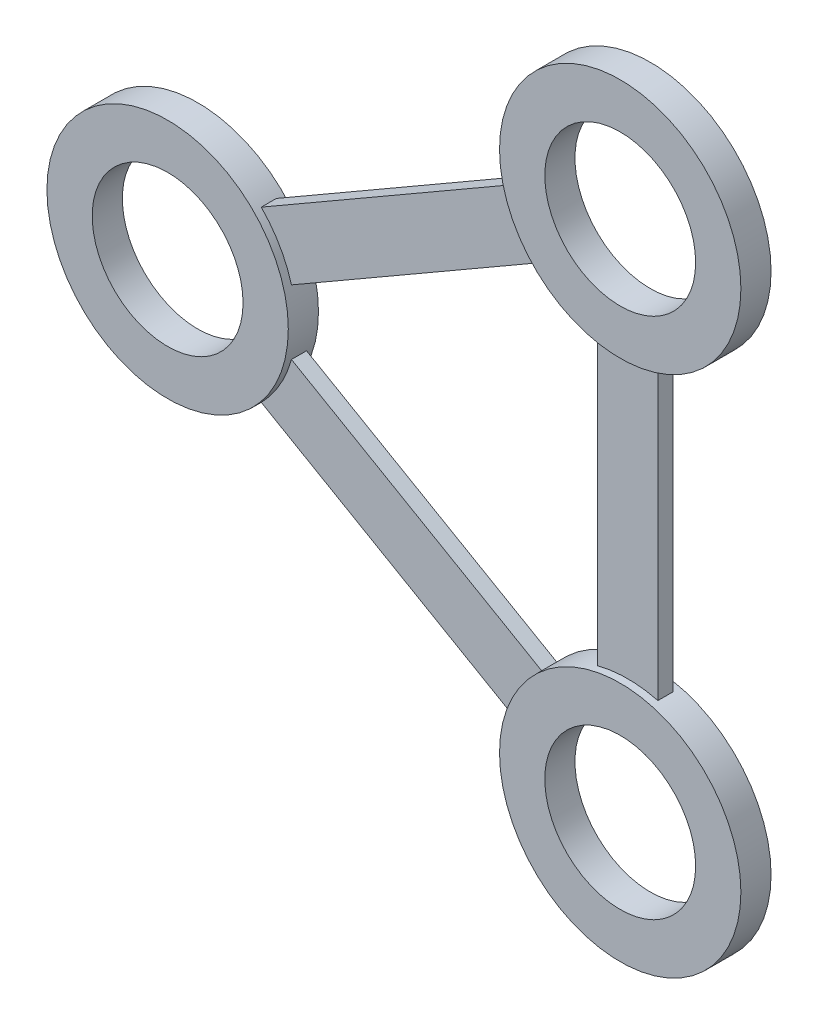
ISO-10303-21;
HEADER;
FILE_DESCRIPTION(('STEP AP214'),'2;1');
FILE_NAME('part.step','',(''),(''),'','','');
FILE_SCHEMA(('AUTOMOTIVE_DESIGN { 1 0 10303 214 1 1 1 1 }'));
ENDSEC;
DATA;
#1=APPLICATION_CONTEXT('core data for automotive mechanical design processes');
#2=APPLICATION_PROTOCOL_DEFINITION('international standard','automotive_design',2000,#1);
#3=PRODUCT_CONTEXT('',#1,'mechanical');
#4=PRODUCT('Part','Part','',(#3));
#5=PRODUCT_RELATED_PRODUCT_CATEGORY('part','',(#4));
#6=PRODUCT_DEFINITION_FORMATION('','',#4);
#7=PRODUCT_DEFINITION_CONTEXT('part definition',#1,'design');
#8=PRODUCT_DEFINITION('design','',#6,#7);
#9=PRODUCT_DEFINITION_SHAPE('','',#8);
#10=(LENGTH_UNIT() NAMED_UNIT(*) SI_UNIT(.MILLI.,.METRE.));
#11=(NAMED_UNIT(*) PLANE_ANGLE_UNIT() SI_UNIT($,.RADIAN.));
#12=(NAMED_UNIT(*) SI_UNIT($,.STERADIAN.) SOLID_ANGLE_UNIT());
#13=UNCERTAINTY_MEASURE_WITH_UNIT(LENGTH_MEASURE(1.E-05),#10,'distance_accuracy_value','');
#14=(GEOMETRIC_REPRESENTATION_CONTEXT(3) GLOBAL_UNCERTAINTY_ASSIGNED_CONTEXT((#13)) GLOBAL_UNIT_ASSIGNED_CONTEXT((#10,
#11,#12)) REPRESENTATION_CONTEXT('',''));
#15=CARTESIAN_POINT('',(0.,0.,0.));
#16=DIRECTION('',(0.,0.,1.));
#17=DIRECTION('',(1.,0.,0.));
#18=AXIS2_PLACEMENT_3D('',#15,#16,#17);
#19=CARTESIAN_POINT('',(-24.7835759049961,42.9264126606929,2.5));
#20=DIRECTION('',(-0.500000000000001,0.866025403784438,0.));
#21=DIRECTION('',(-0.866025403784438,-0.500000000000001,0.));
#22=AXIS2_PLACEMENT_3D('',#19,#20,#21);
#23=PLANE('',#22);
#24=DIRECTION('',(0.866025403784438,0.500000000000001,0.));
#25=VECTOR('',#24,1.);
#26=CARTESIAN_POINT('',(-24.7835759049961,42.9264126606929,-2.5));
#27=LINE('',#26,#25);
#28=CARTESIAN_POINT('',(-50.593283957487,28.0251707688815,-2.5));
#29=VERTEX_POINT('',#28);
#30=CARTESIAN_POINT('',(32.3246767175193,75.8978776852514,-2.5));
#31=VERTEX_POINT('',#30);
#32=EDGE_CURVE('E263',#29,#31,#27,.T.);
#33=ORIENTED_EDGE('',*,*,#32,.F.);
#34=DIRECTION('',(0.,0.,-1.));
#35=VECTOR('',#34,1.);
#36=CARTESIAN_POINT('',(-50.593283957487,28.0251707688815,2.5));
#37=LINE('',#36,#35);
#38=CARTESIAN_POINT('',(-50.593283957487,28.0251707688815,2.5));
#39=VERTEX_POINT('',#38);
#40=EDGE_CURVE('E47',#39,#29,#37,.T.);
#41=ORIENTED_EDGE('',*,*,#40,.F.);
#42=DIRECTION('',(0.866025403784438,0.500000000000001,0.));
#43=VECTOR('',#42,1.);
#44=CARTESIAN_POINT('',(-24.7835759049961,42.9264126606929,2.5));
#45=LINE('',#44,#43);
#46=CARTESIAN_POINT('',(32.3246767175193,75.8978776852514,2.5));
#47=VERTEX_POINT('',#46);
#48=EDGE_CURVE('E247',#39,#47,#45,.T.);
#49=ORIENTED_EDGE('',*,*,#48,.T.);
#50=DIRECTION('',(0.,0.,-1.));
#51=VECTOR('',#50,1.);
#52=CARTESIAN_POINT('',(32.3246767175194,75.8978776852514,2.5));
#53=LINE('',#52,#51);
#54=EDGE_CURVE('E11',#47,#31,#53,.T.);
#55=ORIENTED_EDGE('',*,*,#54,.T.);
#56=EDGE_LOOP('',(#33,#41,#49,#55));
#57=FACE_BOUND('',#56,.T.);
#58=ADVANCED_FACE('F39',(#57),#23,.T.);
#59=CARTESIAN_POINT('',(-14.783575904996,25.6059045850041,2.5));
#60=DIRECTION('',(-0.500000000000001,0.866025403784438,0.));
#61=DIRECTION('',(-0.866025403784438,-0.500000000000001,0.));
#62=AXIS2_PLACEMENT_3D('',#59,#60,#61);
#63=PLANE('',#62);
#64=DIRECTION('',(0.866025403784438,0.500000000000001,0.));
#65=VECTOR('',#64,1.);
#66=CARTESIAN_POINT('',(-14.783575904996,25.6059045850041,-2.5));
#67=LINE('',#66,#65);
#68=CARTESIAN_POINT('',(-40.593283957487,10.7046626931928,-2.5));
#69=VERTEX_POINT('',#68);
#70=CARTESIAN_POINT('',(42.3246767175194,58.5773696095626,-2.5));
#71=VERTEX_POINT('',#70);
#72=EDGE_CURVE('E248',#69,#71,#67,.T.);
#73=ORIENTED_EDGE('',*,*,#72,.T.);
#74=DIRECTION('',(0.,0.,-1.));
#75=VECTOR('',#74,1.);
#76=CARTESIAN_POINT('',(42.3246767175194,58.5773696095626,2.5));
#77=LINE('',#76,#75);
#78=CARTESIAN_POINT('',(42.3246767175194,58.5773696095626,2.5));
#79=VERTEX_POINT('',#78);
#80=EDGE_CURVE('E259',#79,#71,#77,.T.);
#81=ORIENTED_EDGE('',*,*,#80,.F.);
#82=DIRECTION('',(0.866025403784438,0.500000000000001,0.));
#83=VECTOR('',#82,1.);
#84=CARTESIAN_POINT('',(-14.783575904996,25.6059045850041,2.5));
#85=LINE('',#84,#83);
#86=CARTESIAN_POINT('',(-40.593283957487,10.7046626931928,2.5));
#87=VERTEX_POINT('',#86);
#88=EDGE_CURVE('E255',#87,#79,#85,.T.);
#89=ORIENTED_EDGE('',*,*,#88,.F.);
#90=DIRECTION('',(0.,0.,-1.));
#91=VECTOR('',#90,1.);
#92=CARTESIAN_POINT('',(-40.593283957487,10.7046626931928,2.5));
#93=LINE('',#92,#91);
#94=EDGE_CURVE('E276',#87,#69,#93,.T.);
#95=ORIENTED_EDGE('',*,*,#94,.T.);
#96=EDGE_LOOP('',(#73,#81,#89,#95));
#97=FACE_BOUND('',#96,.T.);
#98=ADVANCED_FACE('F293',(#97),#63,.F.);
#99=CARTESIAN_POINT('',(0.,0.,2.5));
#100=DIRECTION('',(0.,0.,1.));
#101=DIRECTION('',(1.,0.,0.));
#102=AXIS2_PLACEMENT_3D('',#99,#100,#101);
#103=PLANE('',#102);
#104=CARTESIAN_POINT('',(70.8656963800162,86.6025403784442,2.5));
#105=DIRECTION('',(0.,0.,1.));
#106=DIRECTION('',(1.,0.,0.));
#107=AXIS2_PLACEMENT_3D('',#104,#105,#106);
#108=CIRCLE('',#107,40.);
#109=EDGE_CURVE('E244',#47,#79,#108,.T.);
#110=ORIENTED_EDGE('',*,*,#109,.F.);
#111=ORIENTED_EDGE('',*,*,#48,.F.);
#112=CARTESIAN_POINT('',(-79.1343036199838,0.,2.5));
#113=DIRECTION('',(0.,0.,1.));
#114=DIRECTION('',(1.,0.,0.));
#115=AXIS2_PLACEMENT_3D('',#112,#113,#114);
#116=CIRCLE('',#115,40.);
#117=EDGE_CURVE('E252',#87,#39,#116,.T.);
#118=ORIENTED_EDGE('',*,*,#117,.F.);
#119=ORIENTED_EDGE('',*,*,#88,.T.);
#120=EDGE_LOOP('',(#110,#111,#118,#119));
#121=FACE_BOUND('',#120,.T.);
#122=ADVANCED_FACE('F297',(#121),#103,.T.);
#123=CARTESIAN_POINT('',(0.,0.,-2.5));
#124=DIRECTION('',(0.,0.,1.));
#125=DIRECTION('',(1.,0.,0.));
#126=AXIS2_PLACEMENT_3D('',#123,#124,#125);
#127=PLANE('',#126);
#128=CARTESIAN_POINT('',(70.8656963800162,86.6025403784442,-2.5));
#129=DIRECTION('',(0.,0.,1.));
#130=DIRECTION('',(1.,0.,0.));
#131=AXIS2_PLACEMENT_3D('',#128,#129,#130);
#132=CIRCLE('',#131,40.);
#133=EDGE_CURVE('E237',#31,#71,#132,.T.);
#134=ORIENTED_EDGE('',*,*,#133,.T.);
#135=ORIENTED_EDGE('',*,*,#72,.F.);
#136=CARTESIAN_POINT('',(-79.1343036199838,0.,-2.5));
#137=DIRECTION('',(0.,0.,1.));
#138=DIRECTION('',(1.,0.,0.));
#139=AXIS2_PLACEMENT_3D('',#136,#137,#138);
#140=CIRCLE('',#139,40.);
#141=EDGE_CURVE('E267',#69,#29,#140,.T.);
#142=ORIENTED_EDGE('',*,*,#141,.T.);
#143=ORIENTED_EDGE('',*,*,#32,.T.);
#144=EDGE_LOOP('',(#134,#135,#142,#143));
#145=FACE_BOUND('',#144,.T.);
#146=ADVANCED_FACE('F290',(#145),#127,.F.);
#147=CARTESIAN_POINT('',(-79.1343036199838,0.,5.));
#148=DIRECTION('',(0.,0.,-1.));
#149=DIRECTION('',(-1.,0.,0.));
#150=AXIS2_PLACEMENT_3D('',#147,#148,#149);
#151=CYLINDRICAL_SURFACE('',#150,25.);
#152=CARTESIAN_POINT('',(-79.1343036199838,0.,5.));
#153=DIRECTION('',(0.,0.,1.));
#154=DIRECTION('',(1.,0.,0.));
#155=AXIS2_PLACEMENT_3D('',#152,#153,#154);
#156=CIRCLE('',#155,25.);
#157=CARTESIAN_POINT('',(-54.1343036199838,0.,5.));
#158=VERTEX_POINT('',#157);
#159=EDGE_CURVE('E228',#158,#158,#156,.T.);
#160=ORIENTED_EDGE('',*,*,#159,.T.);
#161=EDGE_LOOP('',(#160));
#162=FACE_BOUND('',#161,.T.);
#163=CARTESIAN_POINT('',(-79.1343036199838,0.,-5.));
#164=DIRECTION('',(0.,0.,1.));
#165=DIRECTION('',(1.,0.,0.));
#166=AXIS2_PLACEMENT_3D('',#163,#164,#165);
#167=CIRCLE('',#166,25.);
#168=CARTESIAN_POINT('',(-54.1343036199838,0.,-5.));
#169=VERTEX_POINT('',#168);
#170=EDGE_CURVE('E227',#169,#169,#167,.T.);
#171=ORIENTED_EDGE('',*,*,#170,.F.);
#172=EDGE_LOOP('',(#171));
#173=FACE_BOUND('',#172,.T.);
#174=ADVANCED_FACE('F332',(#162,#173),#151,.F.);
#175=CARTESIAN_POINT('',(-79.1343036199838,0.,5.));
#176=DIRECTION('',(0.,0.,-1.));
#177=DIRECTION('',(-1.,0.,0.));
#178=AXIS2_PLACEMENT_3D('',#175,#176,#177);
#179=CYLINDRICAL_SURFACE('',#178,40.);
#180=DIRECTION('',(0.,0.,-1.));
#181=VECTOR('',#180,1.);
#182=CARTESIAN_POINT('',(-50.59292798257,-28.024808237061,2.5));
#183=LINE('',#182,#181);
#184=CARTESIAN_POINT('',(-50.59292798257,-28.024808237061,2.5));
#185=VERTEX_POINT('',#184);
#186=CARTESIAN_POINT('',(-50.59292798257,-28.024808237061,-2.5));
#187=VERTEX_POINT('',#186);
#188=EDGE_CURVE('E216',#185,#187,#183,.T.);
#189=ORIENTED_EDGE('',*,*,#188,.F.);
#190=CARTESIAN_POINT('',(-79.1343036199838,0.,2.5));
#191=DIRECTION('',(0.,0.,1.));
#192=DIRECTION('',(1.,0.,0.));
#193=AXIS2_PLACEMENT_3D('',#190,#191,#192);
#194=CIRCLE('',#193,40.);
#195=CARTESIAN_POINT('',(-40.5931479908568,-10.7041731474885,2.5));
#196=VERTEX_POINT('',#195);
#197=EDGE_CURVE('E192',#185,#196,#194,.T.);
#198=ORIENTED_EDGE('',*,*,#197,.T.);
#199=DIRECTION('',(0.,0.,-1.));
#200=VECTOR('',#199,1.);
#201=CARTESIAN_POINT('',(-40.5931479908568,-10.7041731474885,2.5));
#202=LINE('',#201,#200);
#203=CARTESIAN_POINT('',(-40.5931479908568,-10.7041731474885,-2.5));
#204=VERTEX_POINT('',#203);
#205=EDGE_CURVE('E220',#196,#204,#202,.T.);
#206=ORIENTED_EDGE('',*,*,#205,.T.);
#207=CARTESIAN_POINT('',(-79.1343036199838,0.,-2.5));
#208=DIRECTION('',(0.,0.,1.));
#209=DIRECTION('',(1.,0.,0.));
#210=AXIS2_PLACEMENT_3D('',#207,#208,#209);
#211=CIRCLE('',#210,40.);
#212=EDGE_CURVE('E207',#187,#204,#211,.T.);
#213=ORIENTED_EDGE('',*,*,#212,.F.);
#214=EDGE_LOOP('',(#189,#198,#206,#213));
#215=FACE_BOUND('',#214,.T.);
#216=ORIENTED_EDGE('',*,*,#117,.T.);
#217=ORIENTED_EDGE('',*,*,#40,.T.);
#218=ORIENTED_EDGE('',*,*,#141,.F.);
#219=ORIENTED_EDGE('',*,*,#94,.F.);
#220=EDGE_LOOP('',(#216,#217,#218,#219));
#221=FACE_BOUND('',#220,.T.);
#222=CARTESIAN_POINT('',(-79.1343036199838,0.,5.));
#223=DIRECTION('',(0.,0.,1.));
#224=DIRECTION('',(1.,0.,0.));
#225=AXIS2_PLACEMENT_3D('',#222,#223,#224);
#226=CIRCLE('',#225,40.);
#227=CARTESIAN_POINT('',(-39.1343036199838,0.,5.));
#228=VERTEX_POINT('',#227);
#229=EDGE_CURVE('E232',#228,#228,#226,.T.);
#230=ORIENTED_EDGE('',*,*,#229,.F.);
#231=EDGE_LOOP('',(#230));
#232=FACE_BOUND('',#231,.T.);
#233=CARTESIAN_POINT('',(-79.1343036199838,0.,-5.));
#234=DIRECTION('',(0.,0.,1.));
#235=DIRECTION('',(1.,0.,0.));
#236=AXIS2_PLACEMENT_3D('',#233,#234,#235);
#237=CIRCLE('',#236,40.);
#238=CARTESIAN_POINT('',(-39.1343036199838,0.,-5.));
#239=VERTEX_POINT('',#238);
#240=EDGE_CURVE('E233',#239,#239,#237,.T.);
#241=ORIENTED_EDGE('',*,*,#240,.T.);
#242=EDGE_LOOP('',(#241));
#243=FACE_BOUND('',#242,.T.);
#244=ADVANCED_FACE('F283',(#215,#221,#232,#243),#179,.T.);
#245=CARTESIAN_POINT('',(0.,0.,5.));
#246=DIRECTION('',(0.,0.,1.));
#247=DIRECTION('',(1.,0.,0.));
#248=AXIS2_PLACEMENT_3D('',#245,#246,#247);
#249=PLANE('',#248);
#250=ORIENTED_EDGE('',*,*,#159,.F.);
#251=EDGE_LOOP('',(#250));
#252=FACE_BOUND('',#251,.T.);
#253=ORIENTED_EDGE('',*,*,#229,.T.);
#254=EDGE_LOOP('',(#253));
#255=FACE_BOUND('',#254,.T.);
#256=ADVANCED_FACE('F339',(#252,#255),#249,.T.);
#257=CARTESIAN_POINT('',(0.,0.,-5.));
#258=DIRECTION('',(0.,0.,1.));
#259=DIRECTION('',(1.,0.,0.));
#260=AXIS2_PLACEMENT_3D('',#257,#258,#259);
#261=PLANE('',#260);
#262=ORIENTED_EDGE('',*,*,#170,.T.);
#263=EDGE_LOOP('',(#262));
#264=FACE_BOUND('',#263,.T.);
#265=ORIENTED_EDGE('',*,*,#240,.F.);
#266=EDGE_LOOP('',(#265));
#267=FACE_BOUND('',#266,.T.);
#268=ADVANCED_FACE('F341',(#264,#267),#261,.F.);
#269=CARTESIAN_POINT('',(-14.7828154190323,-25.6053384856218,2.5));
#270=DIRECTION('',(0.499988999717658,0.86603175470726,0.));
#271=DIRECTION('',(-0.86603175470726,0.499988999717658,0.));
#272=AXIS2_PLACEMENT_3D('',#269,#270,#271);
#273=PLANE('',#272);
#274=DIRECTION('',(0.86603175470726,-0.499988999717658,0.));
#275=VECTOR('',#274,1.);
#276=CARTESIAN_POINT('',(-14.7828154190323,-25.6053384856218,-2.5));
#277=LINE('',#276,#275);
#278=CARTESIAN_POINT('',(42.3243207426024,-58.5751917629389,-2.5));
#279=VERTEX_POINT('',#278);
#280=EDGE_CURVE('E203',#204,#279,#277,.T.);
#281=ORIENTED_EDGE('',*,*,#280,.F.);
#282=ORIENTED_EDGE('',*,*,#205,.F.);
#283=DIRECTION('',(0.86603175470726,-0.499988999717658,0.));
#284=VECTOR('',#283,1.);
#285=CARTESIAN_POINT('',(-14.7828154190323,-25.6053384856218,2.5));
#286=LINE('',#285,#284);
#287=CARTESIAN_POINT('',(42.3243207426024,-58.5751917629389,2.5));
#288=VERTEX_POINT('',#287);
#289=EDGE_CURVE('E187',#196,#288,#286,.T.);
#290=ORIENTED_EDGE('',*,*,#289,.T.);
#291=DIRECTION('',(0.,0.,-1.));
#292=VECTOR('',#291,1.);
#293=CARTESIAN_POINT('',(42.3243207426025,-58.575191762939,2.5));
#294=LINE('',#293,#292);
#295=EDGE_CURVE('E223',#288,#279,#294,.T.);
#296=ORIENTED_EDGE('',*,*,#295,.T.);
#297=EDGE_LOOP('',(#281,#282,#290,#296));
#298=FACE_BOUND('',#297,.T.);
#299=ADVANCED_FACE('F344',(#298),#273,.T.);
#300=CARTESIAN_POINT('',(-24.7825954107455,-42.9259735751944,2.5));
#301=DIRECTION('',(0.499988999717658,0.86603175470726,0.));
#302=DIRECTION('',(-0.86603175470726,0.499988999717658,0.));
#303=AXIS2_PLACEMENT_3D('',#300,#301,#302);
#304=PLANE('',#303);
#305=DIRECTION('',(0.86603175470726,-0.499988999717658,0.));
#306=VECTOR('',#305,1.);
#307=CARTESIAN_POINT('',(-24.7825954107455,-42.9259735751944,-2.5));
#308=LINE('',#307,#306);
#309=CARTESIAN_POINT('',(32.3245407508892,-75.8958268525115,-2.5));
#310=VERTEX_POINT('',#309);
#311=EDGE_CURVE('E188',#187,#310,#308,.T.);
#312=ORIENTED_EDGE('',*,*,#311,.T.);
#313=DIRECTION('',(0.,0.,-1.));
#314=VECTOR('',#313,1.);
#315=CARTESIAN_POINT('',(32.3245407508892,-75.8958268525115,2.5));
#316=LINE('',#315,#314);
#317=CARTESIAN_POINT('',(32.3245407508892,-75.8958268525115,2.5));
#318=VERTEX_POINT('',#317);
#319=EDGE_CURVE('E199',#318,#310,#316,.T.);
#320=ORIENTED_EDGE('',*,*,#319,.F.);
#321=DIRECTION('',(0.86603175470726,-0.499988999717658,0.));
#322=VECTOR('',#321,1.);
#323=CARTESIAN_POINT('',(-24.7825954107455,-42.9259735751944,2.5));
#324=LINE('',#323,#322);
#325=EDGE_CURVE('E195',#185,#318,#324,.T.);
#326=ORIENTED_EDGE('',*,*,#325,.F.);
#327=ORIENTED_EDGE('',*,*,#188,.T.);
#328=EDGE_LOOP('',(#312,#320,#326,#327));
#329=FACE_BOUND('',#328,.T.);
#330=ADVANCED_FACE('F351',(#329),#304,.F.);
#331=CARTESIAN_POINT('',(0.,0.,2.5));
#332=DIRECTION('',(0.,0.,1.));
#333=DIRECTION('',(1.,0.,0.));
#334=AXIS2_PLACEMENT_3D('',#331,#332,#333);
#335=PLANE('',#334);
#336=CARTESIAN_POINT('',(70.8656963800162,-86.6,2.5));
#337=DIRECTION('',(0.,0.,1.));
#338=DIRECTION('',(1.,0.,0.));
#339=AXIS2_PLACEMENT_3D('',#336,#337,#338);
#340=CIRCLE('',#339,40.);
#341=EDGE_CURVE('E184',#288,#318,#340,.T.);
#342=ORIENTED_EDGE('',*,*,#341,.F.);
#343=ORIENTED_EDGE('',*,*,#289,.F.);
#344=ORIENTED_EDGE('',*,*,#197,.F.);
#345=ORIENTED_EDGE('',*,*,#325,.T.);
#346=EDGE_LOOP('',(#342,#343,#344,#345));
#347=FACE_BOUND('',#346,.T.);
#348=ADVANCED_FACE('F355',(#347),#335,.T.);
#349=CARTESIAN_POINT('',(0.,0.,-2.5));
#350=DIRECTION('',(0.,0.,1.));
#351=DIRECTION('',(1.,0.,0.));
#352=AXIS2_PLACEMENT_3D('',#349,#350,#351);
#353=PLANE('',#352);
#354=CARTESIAN_POINT('',(70.8656963800162,-86.6,-2.5));
#355=DIRECTION('',(0.,0.,1.));
#356=DIRECTION('',(1.,0.,0.));
#357=AXIS2_PLACEMENT_3D('',#354,#355,#356);
#358=CIRCLE('',#357,40.);
#359=EDGE_CURVE('E177',#279,#310,#358,.T.);
#360=ORIENTED_EDGE('',*,*,#359,.T.);
#361=ORIENTED_EDGE('',*,*,#311,.F.);
#362=ORIENTED_EDGE('',*,*,#212,.T.);
#363=ORIENTED_EDGE('',*,*,#280,.T.);
#364=EDGE_LOOP('',(#360,#361,#362,#363));
#365=FACE_BOUND('',#364,.T.);
#366=ADVANCED_FACE('F357',(#365),#353,.F.);
#367=CARTESIAN_POINT('',(70.8656963800162,86.6025403784442,5.));
#368=DIRECTION('',(0.,0.,-1.));
#369=DIRECTION('',(-1.,0.,0.));
#370=AXIS2_PLACEMENT_3D('',#367,#368,#369);
#371=CYLINDRICAL_SURFACE('',#370,25.);
#372=CARTESIAN_POINT('',(70.8656963800162,86.6025403784442,5.));
#373=DIRECTION('',(0.,0.,1.));
#374=DIRECTION('',(1.,0.,0.));
#375=AXIS2_PLACEMENT_3D('',#372,#373,#374);
#376=CIRCLE('',#375,25.);
#377=CARTESIAN_POINT('',(95.8656963800162,86.6025403784442,5.));
#378=VERTEX_POINT('',#377);
#379=EDGE_CURVE('E168',#378,#378,#376,.T.);
#380=ORIENTED_EDGE('',*,*,#379,.T.);
#381=EDGE_LOOP('',(#380));
#382=FACE_BOUND('',#381,.T.);
#383=CARTESIAN_POINT('',(70.8656963800162,86.6025403784442,-5.));
#384=DIRECTION('',(0.,0.,1.));
#385=DIRECTION('',(1.,0.,0.));
#386=AXIS2_PLACEMENT_3D('',#383,#384,#385);
#387=CIRCLE('',#386,25.);
#388=CARTESIAN_POINT('',(95.8656963800162,86.6025403784442,-5.));
#389=VERTEX_POINT('',#388);
#390=EDGE_CURVE('E167',#389,#389,#387,.T.);
#391=ORIENTED_EDGE('',*,*,#390,.F.);
#392=EDGE_LOOP('',(#391));
#393=FACE_BOUND('',#392,.T.);
#394=ADVANCED_FACE('F303',(#382,#393),#371,.F.);
#395=CARTESIAN_POINT('',(70.8656963800162,86.6025403784442,5.));
#396=DIRECTION('',(0.,0.,-1.));
#397=DIRECTION('',(-1.,0.,0.));
#398=AXIS2_PLACEMENT_3D('',#395,#396,#397);
#399=CYLINDRICAL_SURFACE('',#398,40.);
#400=DIRECTION('',(0.,0.,-1.));
#401=VECTOR('',#400,1.);
#402=CARTESIAN_POINT('',(60.8656963800162,47.87270691637,2.5));
#403=LINE('',#402,#401);
#404=CARTESIAN_POINT('',(60.8656963800162,47.8727069163699,2.5));
#405=VERTEX_POINT('',#404);
#406=CARTESIAN_POINT('',(60.8656963800162,47.8727069163699,-2.5));
#407=VERTEX_POINT('',#406);
#408=EDGE_CURVE('E54',#405,#407,#403,.T.);
#409=ORIENTED_EDGE('',*,*,#408,.F.);
#410=CARTESIAN_POINT('',(70.8656963800162,86.6025403784442,2.5));
#411=DIRECTION('',(0.,0.,1.));
#412=DIRECTION('',(1.,0.,0.));
#413=AXIS2_PLACEMENT_3D('',#410,#411,#412);
#414=CIRCLE('',#413,40.);
#415=CARTESIAN_POINT('',(80.8656963800163,47.87270691637,2.5));
#416=VERTEX_POINT('',#415);
#417=EDGE_CURVE('E59',#405,#416,#414,.T.);
#418=ORIENTED_EDGE('',*,*,#417,.T.);
#419=DIRECTION('',(0.,0.,-1.));
#420=VECTOR('',#419,1.);
#421=CARTESIAN_POINT('',(80.8656963800163,47.87270691637,2.5));
#422=LINE('',#421,#420);
#423=CARTESIAN_POINT('',(80.8656963800163,47.87270691637,-2.5));
#424=VERTEX_POINT('',#423);
#425=EDGE_CURVE('E149',#416,#424,#422,.T.);
#426=ORIENTED_EDGE('',*,*,#425,.T.);
#427=CARTESIAN_POINT('',(70.8656963800162,86.6025403784442,-2.5));
#428=DIRECTION('',(0.,0.,1.));
#429=DIRECTION('',(1.,0.,0.));
#430=AXIS2_PLACEMENT_3D('',#427,#428,#429);
#431=CIRCLE('',#430,40.);
#432=EDGE_CURVE('E153',#407,#424,#431,.T.);
#433=ORIENTED_EDGE('',*,*,#432,.F.);
#434=EDGE_LOOP('',(#409,#418,#426,#433));
#435=FACE_BOUND('',#434,.T.);
#436=ORIENTED_EDGE('',*,*,#109,.T.);
#437=ORIENTED_EDGE('',*,*,#80,.T.);
#438=ORIENTED_EDGE('',*,*,#133,.F.);
#439=ORIENTED_EDGE('',*,*,#54,.F.);
#440=EDGE_LOOP('',(#436,#437,#438,#439));
#441=FACE_BOUND('',#440,.T.);
#442=CARTESIAN_POINT('',(70.8656963800162,86.6025403784442,5.));
#443=DIRECTION('',(0.,0.,1.));
#444=DIRECTION('',(1.,0.,0.));
#445=AXIS2_PLACEMENT_3D('',#442,#443,#444);
#446=CIRCLE('',#445,40.);
#447=CARTESIAN_POINT('',(110.865696380016,86.6025403784442,5.));
#448=VERTEX_POINT('',#447);
#449=EDGE_CURVE('E172',#448,#448,#446,.T.);
#450=ORIENTED_EDGE('',*,*,#449,.F.);
#451=EDGE_LOOP('',(#450));
#452=FACE_BOUND('',#451,.T.);
#453=CARTESIAN_POINT('',(70.8656963800162,86.6025403784442,-5.));
#454=DIRECTION('',(0.,0.,1.));
#455=DIRECTION('',(1.,0.,0.));
#456=AXIS2_PLACEMENT_3D('',#453,#454,#455);
#457=CIRCLE('',#456,40.);
#458=CARTESIAN_POINT('',(110.865696380016,86.6025403784442,-5.));
#459=VERTEX_POINT('',#458);
#460=EDGE_CURVE('E173',#459,#459,#457,.T.);
#461=ORIENTED_EDGE('',*,*,#460,.T.);
#462=EDGE_LOOP('',(#461));
#463=FACE_BOUND('',#462,.T.);
#464=ADVANCED_FACE('F299',(#435,#441,#452,#463),#399,.T.);
#465=CARTESIAN_POINT('',(0.,0.,5.));
#466=DIRECTION('',(0.,0.,1.));
#467=DIRECTION('',(1.,0.,0.));
#468=AXIS2_PLACEMENT_3D('',#465,#466,#467);
#469=PLANE('',#468);
#470=ORIENTED_EDGE('',*,*,#379,.F.);
#471=EDGE_LOOP('',(#470));
#472=FACE_BOUND('',#471,.T.);
#473=ORIENTED_EDGE('',*,*,#449,.T.);
#474=EDGE_LOOP('',(#473));
#475=FACE_BOUND('',#474,.T.);
#476=ADVANCED_FACE('F302',(#472,#475),#469,.T.);
#477=CARTESIAN_POINT('',(0.,0.,-5.));
#478=DIRECTION('',(0.,0.,1.));
#479=DIRECTION('',(1.,0.,0.));
#480=AXIS2_PLACEMENT_3D('',#477,#478,#479);
#481=PLANE('',#480);
#482=ORIENTED_EDGE('',*,*,#390,.T.);
#483=EDGE_LOOP('',(#482));
#484=FACE_BOUND('',#483,.T.);
#485=ORIENTED_EDGE('',*,*,#460,.F.);
#486=EDGE_LOOP('',(#485));
#487=FACE_BOUND('',#486,.T.);
#488=ADVANCED_FACE('F309',(#484,#487),#481,.F.);
#489=CARTESIAN_POINT('',(60.8656963800162,0.,2.5));
#490=DIRECTION('',(1.,0.,0.));
#491=DIRECTION('',(0.,1.,0.));
#492=AXIS2_PLACEMENT_3D('',#489,#490,#491);
#493=PLANE('',#492);
#494=DIRECTION('',(0.,-1.,0.));
#495=VECTOR('',#494,1.);
#496=CARTESIAN_POINT('',(60.8656963800162,0.,-2.5));
#497=LINE('',#496,#495);
#498=CARTESIAN_POINT('',(60.8656963800162,-47.8701665379258,-2.5));
#499=VERTEX_POINT('',#498);
#500=EDGE_CURVE('E140',#407,#499,#497,.T.);
#501=ORIENTED_EDGE('',*,*,#500,.T.);
#502=DIRECTION('',(0.,0.,-1.));
#503=VECTOR('',#502,1.);
#504=CARTESIAN_POINT('',(60.8656963800162,-47.8701665379258,2.5));
#505=LINE('',#504,#503);
#506=CARTESIAN_POINT('',(60.8656963800162,-47.8701665379258,2.5));
#507=VERTEX_POINT('',#506);
#508=EDGE_CURVE('E133',#507,#499,#505,.T.);
#509=ORIENTED_EDGE('',*,*,#508,.F.);
#510=DIRECTION('',(0.,-1.,0.));
#511=VECTOR('',#510,1.);
#512=CARTESIAN_POINT('',(60.8656963800162,0.,2.5));
#513=LINE('',#512,#511);
#514=EDGE_CURVE('E157',#405,#507,#513,.T.);
#515=ORIENTED_EDGE('',*,*,#514,.F.);
#516=ORIENTED_EDGE('',*,*,#408,.T.);
#517=EDGE_LOOP('',(#501,#509,#515,#516));
#518=FACE_BOUND('',#517,.T.);
#519=ADVANCED_FACE('F311',(#518),#493,.F.);
#520=CARTESIAN_POINT('',(80.8656963800163,0.,2.5));
#521=DIRECTION('',(1.,0.,0.));
#522=DIRECTION('',(0.,1.,0.));
#523=AXIS2_PLACEMENT_3D('',#520,#521,#522);
#524=PLANE('',#523);
#525=DIRECTION('',(0.,-1.,0.));
#526=VECTOR('',#525,1.);
#527=CARTESIAN_POINT('',(80.8656963800163,0.,-2.5));
#528=LINE('',#527,#526);
#529=CARTESIAN_POINT('',(80.8656963800163,-47.8701665379258,-2.5));
#530=VERTEX_POINT('',#529);
#531=EDGE_CURVE('E139',#424,#530,#528,.T.);
#532=ORIENTED_EDGE('',*,*,#531,.F.);
#533=ORIENTED_EDGE('',*,*,#425,.F.);
#534=DIRECTION('',(0.,-1.,0.));
#535=VECTOR('',#534,1.);
#536=CARTESIAN_POINT('',(80.8656963800163,0.,2.5));
#537=LINE('',#536,#535);
#538=CARTESIAN_POINT('',(80.8656963800163,-47.8701665379258,2.5));
#539=VERTEX_POINT('',#538);
#540=EDGE_CURVE('E147',#416,#539,#537,.T.);
#541=ORIENTED_EDGE('',*,*,#540,.T.);
#542=DIRECTION('',(0.,0.,-1.));
#543=VECTOR('',#542,1.);
#544=CARTESIAN_POINT('',(80.8656963800163,-47.8701665379258,2.5));
#545=LINE('',#544,#543);
#546=EDGE_CURVE('E130',#539,#530,#545,.T.);
#547=ORIENTED_EDGE('',*,*,#546,.T.);
#548=EDGE_LOOP('',(#532,#533,#541,#547));
#549=FACE_BOUND('',#548,.T.);
#550=ADVANCED_FACE('F145',(#549),#524,.T.);
#551=CARTESIAN_POINT('',(0.,0.,2.5));
#552=DIRECTION('',(0.,0.,1.));
#553=DIRECTION('',(1.,0.,0.));
#554=AXIS2_PLACEMENT_3D('',#551,#552,#553);
#555=PLANE('',#554);
#556=ORIENTED_EDGE('',*,*,#417,.F.);
#557=ORIENTED_EDGE('',*,*,#514,.T.);
#558=CARTESIAN_POINT('',(70.8656963800162,-86.6,2.5));
#559=DIRECTION('',(0.,0.,1.));
#560=DIRECTION('',(1.,0.,0.));
#561=AXIS2_PLACEMENT_3D('',#558,#559,#560);
#562=CIRCLE('',#561,40.);
#563=EDGE_CURVE('E485',#539,#507,#562,.T.);
#564=ORIENTED_EDGE('',*,*,#563,.F.);
#565=ORIENTED_EDGE('',*,*,#540,.F.);
#566=EDGE_LOOP('',(#556,#557,#564,#565));
#567=FACE_BOUND('',#566,.T.);
#568=ADVANCED_FACE('F403',(#567),#555,.T.);
#569=CARTESIAN_POINT('',(0.,0.,-2.5));
#570=DIRECTION('',(0.,0.,1.));
#571=DIRECTION('',(1.,0.,0.));
#572=AXIS2_PLACEMENT_3D('',#569,#570,#571);
#573=PLANE('',#572);
#574=ORIENTED_EDGE('',*,*,#432,.T.);
#575=ORIENTED_EDGE('',*,*,#531,.T.);
#576=CARTESIAN_POINT('',(70.8656963800162,-86.6,-2.5));
#577=DIRECTION('',(0.,0.,1.));
#578=DIRECTION('',(1.,0.,0.));
#579=AXIS2_PLACEMENT_3D('',#576,#577,#578);
#580=CIRCLE('',#579,40.);
#581=EDGE_CURVE('E126',#530,#499,#580,.T.);
#582=ORIENTED_EDGE('',*,*,#581,.T.);
#583=ORIENTED_EDGE('',*,*,#500,.F.);
#584=EDGE_LOOP('',(#574,#575,#582,#583));
#585=FACE_BOUND('',#584,.T.);
#586=ADVANCED_FACE('F152',(#585),#573,.F.);
#587=CARTESIAN_POINT('',(70.8656963800162,-86.6,5.));
#588=DIRECTION('',(0.,0.,-1.));
#589=DIRECTION('',(-1.,0.,0.));
#590=AXIS2_PLACEMENT_3D('',#587,#588,#589);
#591=CYLINDRICAL_SURFACE('',#590,25.);
#592=CARTESIAN_POINT('',(70.8656963800162,-86.6,5.));
#593=DIRECTION('',(0.,0.,1.));
#594=DIRECTION('',(1.,0.,0.));
#595=AXIS2_PLACEMENT_3D('',#592,#593,#594);
#596=CIRCLE('',#595,25.);
#597=CARTESIAN_POINT('',(95.8656963800162,-86.6,5.));
#598=VERTEX_POINT('',#597);
#599=EDGE_CURVE('E472',#598,#598,#596,.T.);
#600=ORIENTED_EDGE('',*,*,#599,.T.);
#601=EDGE_LOOP('',(#600));
#602=FACE_BOUND('',#601,.T.);
#603=CARTESIAN_POINT('',(70.8656963800162,-86.6,-5.));
#604=DIRECTION('',(0.,0.,1.));
#605=DIRECTION('',(1.,0.,0.));
#606=AXIS2_PLACEMENT_3D('',#603,#604,#605);
#607=CIRCLE('',#606,25.);
#608=CARTESIAN_POINT('',(95.8656963800162,-86.6,-5.));
#609=VERTEX_POINT('',#608);
#610=EDGE_CURVE('E466',#609,#609,#607,.T.);
#611=ORIENTED_EDGE('',*,*,#610,.F.);
#612=EDGE_LOOP('',(#611));
#613=FACE_BOUND('',#612,.T.);
#614=ADVANCED_FACE('F421',(#602,#613),#591,.F.);
#615=CARTESIAN_POINT('',(70.8656963800162,-86.6,5.));
#616=DIRECTION('',(0.,0.,-1.));
#617=DIRECTION('',(-1.,0.,0.));
#618=AXIS2_PLACEMENT_3D('',#615,#616,#617);
#619=CYLINDRICAL_SURFACE('',#618,40.);
#620=ORIENTED_EDGE('',*,*,#341,.T.);
#621=ORIENTED_EDGE('',*,*,#319,.T.);
#622=ORIENTED_EDGE('',*,*,#359,.F.);
#623=ORIENTED_EDGE('',*,*,#295,.F.);
#624=EDGE_LOOP('',(#620,#621,#622,#623));
#625=FACE_BOUND('',#624,.T.);
#626=ORIENTED_EDGE('',*,*,#563,.T.);
#627=ORIENTED_EDGE('',*,*,#508,.T.);
#628=ORIENTED_EDGE('',*,*,#581,.F.);
#629=ORIENTED_EDGE('',*,*,#546,.F.);
#630=EDGE_LOOP('',(#626,#627,#628,#629));
#631=FACE_BOUND('',#630,.T.);
#632=CARTESIAN_POINT('',(70.8656963800162,-86.6,5.));
#633=DIRECTION('',(0.,0.,1.));
#634=DIRECTION('',(1.,0.,0.));
#635=AXIS2_PLACEMENT_3D('',#632,#633,#634);
#636=CIRCLE('',#635,40.);
#637=CARTESIAN_POINT('',(110.865696380016,-86.6,5.));
#638=VERTEX_POINT('',#637);
#639=EDGE_CURVE('E477',#638,#638,#636,.T.);
#640=ORIENTED_EDGE('',*,*,#639,.F.);
#641=EDGE_LOOP('',(#640));
#642=FACE_BOUND('',#641,.T.);
#643=CARTESIAN_POINT('',(70.8656963800162,-86.6,-5.));
#644=DIRECTION('',(0.,0.,1.));
#645=DIRECTION('',(1.,0.,0.));
#646=AXIS2_PLACEMENT_3D('',#643,#644,#645);
#647=CIRCLE('',#646,40.);
#648=CARTESIAN_POINT('',(110.865696380016,-86.6,-5.));
#649=VERTEX_POINT('',#648);
#650=EDGE_CURVE('E469',#649,#649,#647,.T.);
#651=ORIENTED_EDGE('',*,*,#650,.T.);
#652=EDGE_LOOP('',(#651));
#653=FACE_BOUND('',#652,.T.);
#654=ADVANCED_FACE('F128',(#625,#631,#642,#653),#619,.T.);
#655=CARTESIAN_POINT('',(0.,0.,5.));
#656=DIRECTION('',(0.,0.,1.));
#657=DIRECTION('',(1.,0.,0.));
#658=AXIS2_PLACEMENT_3D('',#655,#656,#657);
#659=PLANE('',#658);
#660=ORIENTED_EDGE('',*,*,#599,.F.);
#661=EDGE_LOOP('',(#660));
#662=FACE_BOUND('',#661,.T.);
#663=ORIENTED_EDGE('',*,*,#639,.T.);
#664=EDGE_LOOP('',(#663));
#665=FACE_BOUND('',#664,.T.);
#666=ADVANCED_FACE('F439',(#662,#665),#659,.T.);
#667=CARTESIAN_POINT('',(0.,0.,-5.));
#668=DIRECTION('',(0.,0.,1.));
#669=DIRECTION('',(1.,0.,0.));
#670=AXIS2_PLACEMENT_3D('',#667,#668,#669);
#671=PLANE('',#670);
#672=ORIENTED_EDGE('',*,*,#610,.T.);
#673=EDGE_LOOP('',(#672));
#674=FACE_BOUND('',#673,.T.);
#675=ORIENTED_EDGE('',*,*,#650,.F.);
#676=EDGE_LOOP('',(#675));
#677=FACE_BOUND('',#676,.T.);
#678=ADVANCED_FACE('F449',(#674,#677),#671,.F.);
#679=CLOSED_SHELL('',(#58,#98,#122,#146,#174,#244,#256,#268,#299,#330,#348,#366,#394,#464,#476,
#488,#519,#550,#568,#586,#614,#654,#666,#678));
#680=MANIFOLD_SOLID_BREP('B2',#679);
#681=ADVANCED_BREP_SHAPE_REPRESENTATION('',(#18,#680),#14);
#682=SHAPE_DEFINITION_REPRESENTATION(#9,#681);
ENDSEC;
END-ISO-10303-21;
